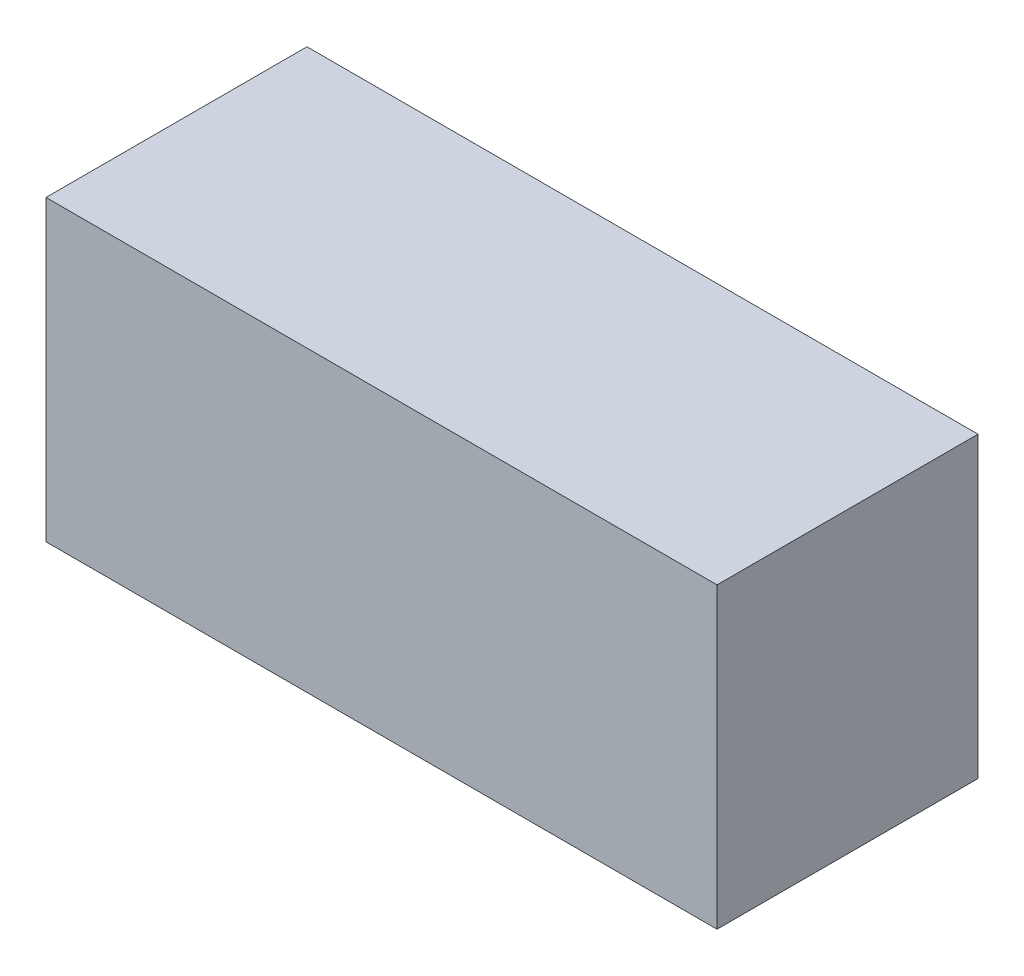
ISO-10303-21;
HEADER;
FILE_DESCRIPTION(('STEP AP214'),'2;1');
FILE_NAME('part.step','',(''),(''),'','','');
FILE_SCHEMA(('AUTOMOTIVE_DESIGN { 1 0 10303 214 1 1 1 1 }'));
ENDSEC;
DATA;
#1=APPLICATION_CONTEXT('core data for automotive mechanical design processes');
#2=APPLICATION_PROTOCOL_DEFINITION('international standard','automotive_design',2000,#1);
#3=PRODUCT_CONTEXT('',#1,'mechanical');
#4=PRODUCT('Part','Part','',(#3));
#5=PRODUCT_RELATED_PRODUCT_CATEGORY('part','',(#4));
#6=PRODUCT_DEFINITION_FORMATION('','',#4);
#7=PRODUCT_DEFINITION_CONTEXT('part definition',#1,'design');
#8=PRODUCT_DEFINITION('design','',#6,#7);
#9=PRODUCT_DEFINITION_SHAPE('','',#8);
#10=(LENGTH_UNIT() NAMED_UNIT(*) SI_UNIT(.MILLI.,.METRE.));
#11=(NAMED_UNIT(*) PLANE_ANGLE_UNIT() SI_UNIT($,.RADIAN.));
#12=(NAMED_UNIT(*) SI_UNIT($,.STERADIAN.) SOLID_ANGLE_UNIT());
#13=UNCERTAINTY_MEASURE_WITH_UNIT(LENGTH_MEASURE(1.E-05),#10,'distance_accuracy_value','');
#14=(GEOMETRIC_REPRESENTATION_CONTEXT(3) GLOBAL_UNCERTAINTY_ASSIGNED_CONTEXT((#13)) GLOBAL_UNIT_ASSIGNED_CONTEXT((#10,
#11,#12)) REPRESENTATION_CONTEXT('',''));
#15=CARTESIAN_POINT('',(0.,0.,0.));
#16=DIRECTION('',(0.,0.,1.));
#17=DIRECTION('',(1.,0.,0.));
#18=AXIS2_PLACEMENT_3D('',#15,#16,#17);
#19=CARTESIAN_POINT('',(0.,0.,0.35));
#20=DIRECTION('',(0.,0.,1.));
#21=DIRECTION('',(1.,0.,0.));
#22=AXIS2_PLACEMENT_3D('',#19,#20,#21);
#23=PLANE('',#22);
#24=DIRECTION('',(1.,0.,0.));
#25=VECTOR('',#24,1.);
#26=CARTESIAN_POINT('',(-0.45,-0.2,0.35));
#27=LINE('',#26,#25);
#28=CARTESIAN_POINT('',(0.45,-0.2,0.35));
#29=VERTEX_POINT('',#28);
#30=CARTESIAN_POINT('',(-0.45,-0.2,0.35));
#31=VERTEX_POINT('',#30);
#32=EDGE_CURVE('E67',#29,#31,#27,.F.);
#33=ORIENTED_EDGE('',*,*,#32,.F.);
#34=DIRECTION('',(0.,1.,0.));
#35=VECTOR('',#34,1.);
#36=CARTESIAN_POINT('',(0.45,-0.2,0.35));
#37=LINE('',#36,#35);
#38=CARTESIAN_POINT('',(0.45,0.2,0.35));
#39=VERTEX_POINT('',#38);
#40=EDGE_CURVE('E19',#39,#29,#37,.F.);
#41=ORIENTED_EDGE('',*,*,#40,.F.);
#42=DIRECTION('',(1.,0.,0.));
#43=VECTOR('',#42,1.);
#44=CARTESIAN_POINT('',(0.45,0.2,0.35));
#45=LINE('',#44,#43);
#46=CARTESIAN_POINT('',(-0.45,0.2,0.35));
#47=VERTEX_POINT('',#46);
#48=EDGE_CURVE('E57',#47,#39,#45,.T.);
#49=ORIENTED_EDGE('',*,*,#48,.F.);
#50=DIRECTION('',(0.,1.,0.));
#51=VECTOR('',#50,1.);
#52=CARTESIAN_POINT('',(-0.45,0.2,0.35));
#53=LINE('',#52,#51);
#54=EDGE_CURVE('E52',#31,#47,#53,.T.);
#55=ORIENTED_EDGE('',*,*,#54,.F.);
#56=EDGE_LOOP('',(#33,#41,#49,#55));
#57=FACE_BOUND('',#56,.T.);
#58=ADVANCED_FACE('F16',(#57),#23,.T.);
#59=CARTESIAN_POINT('',(0.45,-0.2,0.));
#60=DIRECTION('',(1.,0.,0.));
#61=DIRECTION('',(0.,0.,-1.));
#62=AXIS2_PLACEMENT_3D('',#59,#60,#61);
#63=PLANE('',#62);
#64=DIRECTION('',(0.,0.,-1.));
#65=VECTOR('',#64,1.);
#66=CARTESIAN_POINT('',(0.45,-0.2,0.));
#67=LINE('',#66,#65);
#68=CARTESIAN_POINT('',(0.45,-0.2,0.));
#69=VERTEX_POINT('',#68);
#70=EDGE_CURVE('E78',#69,#29,#67,.F.);
#71=ORIENTED_EDGE('',*,*,#70,.F.);
#72=DIRECTION('',(0.,1.,0.));
#73=VECTOR('',#72,1.);
#74=CARTESIAN_POINT('',(0.45,0.,0.));
#75=LINE('',#74,#73);
#76=CARTESIAN_POINT('',(0.45,0.2,0.));
#77=VERTEX_POINT('',#76);
#78=EDGE_CURVE('E73',#69,#77,#75,.T.);
#79=ORIENTED_EDGE('',*,*,#78,.T.);
#80=DIRECTION('',(0.,0.,1.));
#81=VECTOR('',#80,1.);
#82=CARTESIAN_POINT('',(0.45,0.2,0.));
#83=LINE('',#82,#81);
#84=EDGE_CURVE('E62',#39,#77,#83,.F.);
#85=ORIENTED_EDGE('',*,*,#84,.F.);
#86=ORIENTED_EDGE('',*,*,#40,.T.);
#87=EDGE_LOOP('',(#71,#79,#85,#86));
#88=FACE_BOUND('',#87,.T.);
#89=ADVANCED_FACE('F72',(#88),#63,.T.);
#90=CARTESIAN_POINT('',(0.45,0.2,0.));
#91=DIRECTION('',(0.,1.,0.));
#92=DIRECTION('',(0.,0.,1.));
#93=AXIS2_PLACEMENT_3D('',#90,#91,#92);
#94=PLANE('',#93);
#95=ORIENTED_EDGE('',*,*,#84,.T.);
#96=DIRECTION('',(1.,0.,0.));
#97=VECTOR('',#96,1.);
#98=CARTESIAN_POINT('',(0.,0.2,0.));
#99=LINE('',#98,#97);
#100=CARTESIAN_POINT('',(-0.45,0.2,0.));
#101=VERTEX_POINT('',#100);
#102=EDGE_CURVE('E83',#77,#101,#99,.F.);
#103=ORIENTED_EDGE('',*,*,#102,.T.);
#104=DIRECTION('',(0.,0.,1.));
#105=VECTOR('',#104,1.);
#106=CARTESIAN_POINT('',(-0.45,0.2,0.));
#107=LINE('',#106,#105);
#108=EDGE_CURVE('E64',#47,#101,#107,.F.);
#109=ORIENTED_EDGE('',*,*,#108,.F.);
#110=ORIENTED_EDGE('',*,*,#48,.T.);
#111=EDGE_LOOP('',(#95,#103,#109,#110));
#112=FACE_BOUND('',#111,.T.);
#113=ADVANCED_FACE('F59',(#112),#94,.T.);
#114=CARTESIAN_POINT('',(-0.45,0.2,0.));
#115=DIRECTION('',(-1.,0.,0.));
#116=DIRECTION('',(0.,0.,1.));
#117=AXIS2_PLACEMENT_3D('',#114,#115,#116);
#118=PLANE('',#117);
#119=ORIENTED_EDGE('',*,*,#108,.T.);
#120=DIRECTION('',(0.,1.,0.));
#121=VECTOR('',#120,1.);
#122=CARTESIAN_POINT('',(-0.45,0.,0.));
#123=LINE('',#122,#121);
#124=CARTESIAN_POINT('',(-0.45,-0.2,0.));
#125=VERTEX_POINT('',#124);
#126=EDGE_CURVE('E25',#101,#125,#123,.F.);
#127=ORIENTED_EDGE('',*,*,#126,.T.);
#128=DIRECTION('',(0.,0.,-1.));
#129=VECTOR('',#128,1.);
#130=CARTESIAN_POINT('',(-0.45,-0.2,0.));
#131=LINE('',#130,#129);
#132=EDGE_CURVE('E33',#31,#125,#131,.T.);
#133=ORIENTED_EDGE('',*,*,#132,.F.);
#134=ORIENTED_EDGE('',*,*,#54,.T.);
#135=EDGE_LOOP('',(#119,#127,#133,#134));
#136=FACE_BOUND('',#135,.T.);
#137=ADVANCED_FACE('F87',(#136),#118,.T.);
#138=CARTESIAN_POINT('',(-0.45,-0.2,0.));
#139=DIRECTION('',(0.,-1.,0.));
#140=DIRECTION('',(0.,0.,-1.));
#141=AXIS2_PLACEMENT_3D('',#138,#139,#140);
#142=PLANE('',#141);
#143=ORIENTED_EDGE('',*,*,#132,.T.);
#144=DIRECTION('',(1.,0.,0.));
#145=VECTOR('',#144,1.);
#146=CARTESIAN_POINT('',(0.,-0.2,0.));
#147=LINE('',#146,#145);
#148=EDGE_CURVE('E11',#125,#69,#147,.T.);
#149=ORIENTED_EDGE('',*,*,#148,.T.);
#150=ORIENTED_EDGE('',*,*,#70,.T.);
#151=ORIENTED_EDGE('',*,*,#32,.T.);
#152=EDGE_LOOP('',(#143,#149,#150,#151));
#153=FACE_BOUND('',#152,.T.);
#154=ADVANCED_FACE('F90',(#153),#142,.T.);
#155=CARTESIAN_POINT('',(0.,0.,0.));
#156=DIRECTION('',(0.,0.,1.));
#157=DIRECTION('',(1.,0.,0.));
#158=AXIS2_PLACEMENT_3D('',#155,#156,#157);
#159=PLANE('',#158);
#160=ORIENTED_EDGE('',*,*,#126,.F.);
#161=ORIENTED_EDGE('',*,*,#102,.F.);
#162=ORIENTED_EDGE('',*,*,#78,.F.);
#163=ORIENTED_EDGE('',*,*,#148,.F.);
#164=EDGE_LOOP('',(#160,#161,#162,#163));
#165=FACE_BOUND('',#164,.T.);
#166=ADVANCED_FACE('F89',(#165),#159,.F.);
#167=CLOSED_SHELL('',(#58,#89,#113,#137,#154,#166));
#168=MANIFOLD_SOLID_BREP('B1',#167);
#169=ADVANCED_BREP_SHAPE_REPRESENTATION('',(#18,#168),#14);
#170=SHAPE_DEFINITION_REPRESENTATION(#9,#169);
ENDSEC;
END-ISO-10303-21;
